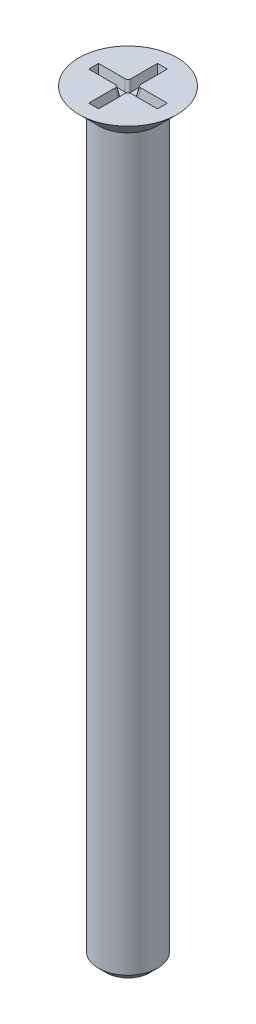
ISO-10303-21;
HEADER;
FILE_DESCRIPTION(('STEP AP214'),'2;1');
FILE_NAME('part.step','',(''),(''),'','','');
FILE_SCHEMA(('AUTOMOTIVE_DESIGN { 1 0 10303 214 1 1 1 1 }'));
ENDSEC;
DATA;
#1=APPLICATION_CONTEXT('core data for automotive mechanical design processes');
#2=APPLICATION_PROTOCOL_DEFINITION('international standard','automotive_design',2000,#1);
#3=PRODUCT_CONTEXT('',#1,'mechanical');
#4=PRODUCT('Part','Part','',(#3));
#5=PRODUCT_RELATED_PRODUCT_CATEGORY('part','',(#4));
#6=PRODUCT_DEFINITION_FORMATION('','',#4);
#7=PRODUCT_DEFINITION_CONTEXT('part definition',#1,'design');
#8=PRODUCT_DEFINITION('design','',#6,#7);
#9=PRODUCT_DEFINITION_SHAPE('','',#8);
#10=(LENGTH_UNIT() NAMED_UNIT(*) SI_UNIT(.MILLI.,.METRE.));
#11=(NAMED_UNIT(*) PLANE_ANGLE_UNIT() SI_UNIT($,.RADIAN.));
#12=(NAMED_UNIT(*) SI_UNIT($,.STERADIAN.) SOLID_ANGLE_UNIT());
#13=UNCERTAINTY_MEASURE_WITH_UNIT(LENGTH_MEASURE(1.E-05),#10,'distance_accuracy_value','');
#14=(GEOMETRIC_REPRESENTATION_CONTEXT(3) GLOBAL_UNCERTAINTY_ASSIGNED_CONTEXT((#13)) GLOBAL_UNIT_ASSIGNED_CONTEXT((#10,
#11,#12)) REPRESENTATION_CONTEXT('',''));
#15=CARTESIAN_POINT('',(0.,0.,0.));
#16=DIRECTION('',(0.,0.,1.));
#17=DIRECTION('',(1.,0.,0.));
#18=AXIS2_PLACEMENT_3D('',#15,#16,#17);
#19=CARTESIAN_POINT('',(0.,0.,0.));
#20=DIRECTION('',(0.,1.,0.));
#21=DIRECTION('',(0.,0.,1.));
#22=AXIS2_PLACEMENT_3D('',#19,#20,#21);
#23=PLANE('',#22);
#24=CARTESIAN_POINT('',(0.,0.,0.));
#25=DIRECTION('',(0.,-1.,0.));
#26=DIRECTION('',(0.,0.,-1.));
#27=AXIS2_PLACEMENT_3D('',#24,#25,#26);
#28=CIRCLE('',#27,5.);
#29=CARTESIAN_POINT('',(0.,0.,-5.));
#30=VERTEX_POINT('',#29);
#31=EDGE_CURVE('E258',#30,#30,#28,.T.);
#32=ORIENTED_EDGE('',*,*,#31,.F.);
#33=EDGE_LOOP('',(#32));
#34=FACE_BOUND('',#33,.T.);
#35=DIRECTION('',(1.,0.,0.));
#36=VECTOR('',#35,1.);
#37=CARTESIAN_POINT('',(0.,0.,-0.5));
#38=LINE('',#37,#36);
#39=CARTESIAN_POINT('',(-3.5,0.,-0.5));
#40=VERTEX_POINT('',#39);
#41=CARTESIAN_POINT('',(-0.795442325903664,0.,-0.5));
#42=VERTEX_POINT('',#41);
#43=EDGE_CURVE('E188',#40,#42,#38,.T.);
#44=ORIENTED_EDGE('',*,*,#43,.T.);
#45=CARTESIAN_POINT('',(-0.804627983565725,0.,-0.804627983565723));
#46=DIRECTION('',(0.,1.,0.));
#47=DIRECTION('',(-0.707106781186548,0.,-0.707106781186547));
#48=AXIS2_PLACEMENT_3D('',#45,#46,#47);
#49=ELLIPSE('',#48,0.309186702079241,0.3);
#50=CARTESIAN_POINT('',(-0.500000000000002,0.,-0.795442325903662));
#51=VERTEX_POINT('',#50);
#52=EDGE_CURVE('E276',#42,#51,#49,.T.);
#53=ORIENTED_EDGE('',*,*,#52,.T.);
#54=DIRECTION('',(0.,0.,1.));
#55=VECTOR('',#54,1.);
#56=CARTESIAN_POINT('',(-0.500000000000001,0.,0.));
#57=LINE('',#56,#55);
#58=CARTESIAN_POINT('',(-0.500000000000002,0.,-3.5));
#59=VERTEX_POINT('',#58);
#60=EDGE_CURVE('E186',#59,#51,#57,.T.);
#61=ORIENTED_EDGE('',*,*,#60,.F.);
#62=DIRECTION('',(1.,0.,0.));
#63=VECTOR('',#62,1.);
#64=CARTESIAN_POINT('',(0.,0.,-3.5));
#65=LINE('',#64,#63);
#66=CARTESIAN_POINT('',(0.499999999999998,0.,-3.5));
#67=VERTEX_POINT('',#66);
#68=EDGE_CURVE('E165',#59,#67,#65,.T.);
#69=ORIENTED_EDGE('',*,*,#68,.T.);
#70=DIRECTION('',(0.,0.,1.));
#71=VECTOR('',#70,1.);
#72=CARTESIAN_POINT('',(0.499999999999999,0.,0.));
#73=LINE('',#72,#71);
#74=CARTESIAN_POINT('',(0.499999999999999,0.,-0.795442325903662));
#75=VERTEX_POINT('',#74);
#76=EDGE_CURVE('E177',#67,#75,#73,.T.);
#77=ORIENTED_EDGE('',*,*,#76,.T.);
#78=CARTESIAN_POINT('',(0.804627983565722,0.,-0.804627983565723));
#79=DIRECTION('',(0.,1.,0.));
#80=DIRECTION('',(0.707106781186547,0.,-0.707106781186548));
#81=AXIS2_PLACEMENT_3D('',#78,#79,#80);
#82=ELLIPSE('',#81,0.309186702079241,0.3);
#83=CARTESIAN_POINT('',(0.795442325903661,0.,-0.5));
#84=VERTEX_POINT('',#83);
#85=EDGE_CURVE('E274',#75,#84,#82,.T.);
#86=ORIENTED_EDGE('',*,*,#85,.T.);
#87=DIRECTION('',(1.,0.,0.));
#88=VECTOR('',#87,1.);
#89=CARTESIAN_POINT('',(0.,0.,-0.5));
#90=LINE('',#89,#88);
#91=CARTESIAN_POINT('',(3.5,0.,-0.5));
#92=VERTEX_POINT('',#91);
#93=EDGE_CURVE('E182',#84,#92,#90,.T.);
#94=ORIENTED_EDGE('',*,*,#93,.T.);
#95=DIRECTION('',(0.,0.,-1.));
#96=VECTOR('',#95,1.);
#97=CARTESIAN_POINT('',(3.5,0.,0.));
#98=LINE('',#97,#96);
#99=CARTESIAN_POINT('',(3.5,0.,0.5));
#100=VERTEX_POINT('',#99);
#101=EDGE_CURVE('E208',#100,#92,#98,.T.);
#102=ORIENTED_EDGE('',*,*,#101,.F.);
#103=DIRECTION('',(1.,0.,0.));
#104=VECTOR('',#103,1.);
#105=CARTESIAN_POINT('',(0.,0.,0.5));
#106=LINE('',#105,#104);
#107=CARTESIAN_POINT('',(0.795442325903661,0.,0.5));
#108=VERTEX_POINT('',#107);
#109=EDGE_CURVE('E206',#108,#100,#106,.T.);
#110=ORIENTED_EDGE('',*,*,#109,.F.);
#111=CARTESIAN_POINT('',(0.804627983565722,0.,0.804627983565724));
#112=DIRECTION('',(0.,1.,0.));
#113=DIRECTION('',(0.707106781186548,0.,0.707106781186547));
#114=AXIS2_PLACEMENT_3D('',#111,#112,#113);
#115=ELLIPSE('',#114,0.309186702079241,0.3);
#116=CARTESIAN_POINT('',(0.499999999999999,0.,0.795442325903662));
#117=VERTEX_POINT('',#116);
#118=EDGE_CURVE('E270',#108,#117,#115,.T.);
#119=ORIENTED_EDGE('',*,*,#118,.T.);
#120=DIRECTION('',(0.,0.,1.));
#121=VECTOR('',#120,1.);
#122=CARTESIAN_POINT('',(0.499999999999999,0.,0.));
#123=LINE('',#122,#121);
#124=CARTESIAN_POINT('',(0.499999999999999,0.,3.5));
#125=VERTEX_POINT('',#124);
#126=EDGE_CURVE('E204',#117,#125,#123,.T.);
#127=ORIENTED_EDGE('',*,*,#126,.T.);
#128=DIRECTION('',(1.,0.,0.));
#129=VECTOR('',#128,1.);
#130=CARTESIAN_POINT('',(0.,0.,3.5));
#131=LINE('',#130,#129);
#132=CARTESIAN_POINT('',(-0.500000000000001,0.,3.5));
#133=VERTEX_POINT('',#132);
#134=EDGE_CURVE('E201',#133,#125,#131,.T.);
#135=ORIENTED_EDGE('',*,*,#134,.F.);
#136=DIRECTION('',(0.,0.,1.));
#137=VECTOR('',#136,1.);
#138=CARTESIAN_POINT('',(-0.500000000000001,0.,0.));
#139=LINE('',#138,#137);
#140=CARTESIAN_POINT('',(-0.500000000000001,0.,0.795442325903662));
#141=VERTEX_POINT('',#140);
#142=EDGE_CURVE('E199',#141,#133,#139,.T.);
#143=ORIENTED_EDGE('',*,*,#142,.F.);
#144=CARTESIAN_POINT('',(-0.804627983565725,0.,0.804627983565724));
#145=DIRECTION('',(0.,1.,0.));
#146=DIRECTION('',(-0.707106781186547,0.,0.707106781186548));
#147=AXIS2_PLACEMENT_3D('',#144,#145,#146);
#148=ELLIPSE('',#147,0.309186702079241,0.3);
#149=CARTESIAN_POINT('',(-0.795442325903664,0.,0.5));
#150=VERTEX_POINT('',#149);
#151=EDGE_CURVE('E272',#141,#150,#148,.T.);
#152=ORIENTED_EDGE('',*,*,#151,.T.);
#153=DIRECTION('',(1.,0.,0.));
#154=VECTOR('',#153,1.);
#155=CARTESIAN_POINT('',(0.,0.,0.5));
#156=LINE('',#155,#154);
#157=CARTESIAN_POINT('',(-3.5,0.,0.5));
#158=VERTEX_POINT('',#157);
#159=EDGE_CURVE('E196',#158,#150,#156,.T.);
#160=ORIENTED_EDGE('',*,*,#159,.F.);
#161=DIRECTION('',(0.,0.,-1.));
#162=VECTOR('',#161,1.);
#163=CARTESIAN_POINT('',(-3.5,0.,0.));
#164=LINE('',#163,#162);
#165=EDGE_CURVE('E193',#158,#40,#164,.T.);
#166=ORIENTED_EDGE('',*,*,#165,.T.);
#167=EDGE_LOOP('',(#44,#53,#61,#69,#77,#86,#94,#102,#110,#119,#127,#135,#143,#152,#160,#166));
#168=FACE_BOUND('',#167,.T.);
#169=ADVANCED_FACE('F49',(#34,#168),#23,.T.);
#170=CARTESIAN_POINT('',(0.,-2.,0.));
#171=DIRECTION('',(0.,1.,0.));
#172=DIRECTION('',(0.,0.,1.));
#173=AXIS2_PLACEMENT_3D('',#170,#171,#172);
#174=CONICAL_SURFACE('',#173,3.,0.785398163397448);
#175=ORIENTED_EDGE('',*,*,#31,.T.);
#176=EDGE_LOOP('',(#175));
#177=FACE_BOUND('',#176,.T.);
#178=CARTESIAN_POINT('',(0.,-2.,0.));
#179=DIRECTION('',(0.,-1.,0.));
#180=DIRECTION('',(0.,0.,-1.));
#181=AXIS2_PLACEMENT_3D('',#178,#179,#180);
#182=CIRCLE('',#181,3.);
#183=CARTESIAN_POINT('',(0.,-2.,-3.));
#184=VERTEX_POINT('',#183);
#185=EDGE_CURVE('E214',#184,#184,#182,.T.);
#186=ORIENTED_EDGE('',*,*,#185,.F.);
#187=EDGE_LOOP('',(#186));
#188=FACE_BOUND('',#187,.T.);
#189=ADVANCED_FACE('F353',(#177,#188),#174,.T.);
#190=CARTESIAN_POINT('',(0.,-77.,0.));
#191=DIRECTION('',(0.,1.,0.));
#192=DIRECTION('',(0.,0.,1.));
#193=AXIS2_PLACEMENT_3D('',#190,#191,#192);
#194=CYLINDRICAL_SURFACE('',#193,3.);
#195=CARTESIAN_POINT('',(0.,-76.2,0.));
#196=DIRECTION('',(0.,-1.,0.));
#197=DIRECTION('',(0.,0.,-1.));
#198=AXIS2_PLACEMENT_3D('',#195,#196,#197);
#199=CIRCLE('',#198,3.);
#200=CARTESIAN_POINT('',(0.,-76.2,-3.));
#201=VERTEX_POINT('',#200);
#202=EDGE_CURVE('E264',#201,#201,#199,.F.);
#203=ORIENTED_EDGE('',*,*,#202,.T.);
#204=EDGE_LOOP('',(#203));
#205=FACE_BOUND('',#204,.T.);
#206=ORIENTED_EDGE('',*,*,#185,.T.);
#207=EDGE_LOOP('',(#206));
#208=FACE_BOUND('',#207,.T.);
#209=ADVANCED_FACE('F361',(#205,#208),#194,.T.);
#210=CARTESIAN_POINT('',(0.,-77.,0.));
#211=DIRECTION('',(0.,-1.,0.));
#212=DIRECTION('',(0.,0.,-1.));
#213=AXIS2_PLACEMENT_3D('',#210,#211,#212);
#214=PLANE('',#213);
#215=CARTESIAN_POINT('',(0.,-77.,0.));
#216=DIRECTION('',(0.,-1.,0.));
#217=DIRECTION('',(0.,0.,-1.));
#218=AXIS2_PLACEMENT_3D('',#215,#216,#217);
#219=CIRCLE('',#218,2.20000000000001);
#220=CARTESIAN_POINT('',(0.,-77.,-2.20000000000001));
#221=VERTEX_POINT('',#220);
#222=EDGE_CURVE('E261',#221,#221,#219,.T.);
#223=ORIENTED_EDGE('',*,*,#222,.T.);
#224=EDGE_LOOP('',(#223));
#225=FACE_BOUND('',#224,.T.);
#226=ADVANCED_FACE('F373',(#225),#214,.T.);
#227=CARTESIAN_POINT('',(0.,-77.,0.));
#228=DIRECTION('',(0.,1.,0.));
#229=DIRECTION('',(0.,0.,1.));
#230=AXIS2_PLACEMENT_3D('',#227,#228,#229);
#231=CONICAL_SURFACE('',#230,2.20000000000001,0.785398163397443);
#232=ORIENTED_EDGE('',*,*,#202,.F.);
#233=EDGE_LOOP('',(#232));
#234=FACE_BOUND('',#233,.T.);
#235=ORIENTED_EDGE('',*,*,#222,.F.);
#236=EDGE_LOOP('',(#235));
#237=FACE_BOUND('',#236,.T.);
#238=ADVANCED_FACE('F368',(#234,#237),#231,.T.);
#239=CARTESIAN_POINT('',(0.,0.,-0.5));
#240=DIRECTION('',(0.,-0.17364817766693,-0.984807753012208));
#241=DIRECTION('',(0.,0.984807753012208,-0.17364817766693));
#242=AXIS2_PLACEMENT_3D('',#239,#240,#241);
#243=PLANE('',#242);
#244=ORIENTED_EDGE('',*,*,#93,.F.);
#245=DIRECTION('',(-0.171087869746036,-0.970287525247814,0.171087869746036));
#246=VECTOR('',#245,1.);
#247=CARTESIAN_POINT('',(0.772158886512443,-0.132046946517587,-0.476716560608782));
#248=LINE('',#247,#246);
#249=CARTESIAN_POINT('',(0.619115345195196,-1.,-0.323673019291535));
#250=VERTEX_POINT('',#249);
#251=EDGE_CURVE('E281',#84,#250,#248,.T.);
#252=ORIENTED_EDGE('',*,*,#251,.T.);
#253=DIRECTION('',(-1.,0.,0.));
#254=VECTOR('',#253,1.);
#255=CARTESIAN_POINT('',(0.,-1.,-0.323673019291535));
#256=LINE('',#255,#254);
#257=CARTESIAN_POINT('',(3.32367301929154,-1.,-0.323673019291535));
#258=VERTEX_POINT('',#257);
#259=EDGE_CURVE('E211',#250,#258,#256,.F.);
#260=ORIENTED_EDGE('',*,*,#259,.T.);
#261=DIRECTION('',(-0.171087869746036,-0.970287525247814,0.171087869746036));
#262=VECTOR('',#261,1.);
#263=CARTESIAN_POINT('',(3.39755129289017,-0.581015490075304,-0.397551292890172));
#264=LINE('',#263,#262);
#265=EDGE_CURVE('E212',#258,#92,#264,.F.);
#266=ORIENTED_EDGE('',*,*,#265,.T.);
#267=EDGE_LOOP('',(#244,#252,#260,#266));
#268=FACE_BOUND('',#267,.T.);
#269=ADVANCED_FACE('F337',(#268),#243,.F.);
#270=CARTESIAN_POINT('',(3.5,0.,0.));
#271=DIRECTION('',(0.984807753012208,-0.17364817766693,0.));
#272=DIRECTION('',(0.17364817766693,0.984807753012208,0.));
#273=AXIS2_PLACEMENT_3D('',#270,#271,#272);
#274=PLANE('',#273);
#275=ORIENTED_EDGE('',*,*,#101,.T.);
#276=ORIENTED_EDGE('',*,*,#265,.F.);
#277=DIRECTION('',(0.,0.,-1.));
#278=VECTOR('',#277,1.);
#279=CARTESIAN_POINT('',(3.32367301929154,-1.,0.));
#280=LINE('',#279,#278);
#281=CARTESIAN_POINT('',(3.32367301929154,-1.,0.323673019291535));
#282=VERTEX_POINT('',#281);
#283=EDGE_CURVE('E173',#282,#258,#280,.T.);
#284=ORIENTED_EDGE('',*,*,#283,.F.);
#285=DIRECTION('',(0.171087869746036,0.970287525247814,0.171087869746036));
#286=VECTOR('',#285,1.);
#287=CARTESIAN_POINT('',(3.39755129289017,-0.581015490075304,0.397551292890173));
#288=LINE('',#287,#286);
#289=EDGE_CURVE('E215',#282,#100,#288,.T.);
#290=ORIENTED_EDGE('',*,*,#289,.T.);
#291=EDGE_LOOP('',(#275,#276,#284,#290));
#292=FACE_BOUND('',#291,.T.);
#293=ADVANCED_FACE('F341',(#292),#274,.F.);
#294=CARTESIAN_POINT('',(0.,0.,0.5));
#295=DIRECTION('',(0.,-0.17364817766693,0.984807753012208));
#296=DIRECTION('',(0.,-0.984807753012208,-0.17364817766693));
#297=AXIS2_PLACEMENT_3D('',#294,#295,#296);
#298=PLANE('',#297);
#299=DIRECTION('',(1.,0.,0.));
#300=VECTOR('',#299,1.);
#301=CARTESIAN_POINT('',(0.,-1.,0.323673019291535));
#302=LINE('',#301,#300);
#303=CARTESIAN_POINT('',(0.619115345195196,-1.,0.323673019291535));
#304=VERTEX_POINT('',#303);
#305=EDGE_CURVE('E234',#304,#282,#302,.T.);
#306=ORIENTED_EDGE('',*,*,#305,.F.);
#307=DIRECTION('',(-0.171087869746036,-0.970287525247814,-0.171087869746036));
#308=VECTOR('',#307,1.);
#309=CARTESIAN_POINT('',(0.786794416099561,-0.0490447336496869,0.4913520901959));
#310=LINE('',#309,#308);
#311=EDGE_CURVE('E288',#304,#108,#310,.F.);
#312=ORIENTED_EDGE('',*,*,#311,.T.);
#313=ORIENTED_EDGE('',*,*,#109,.T.);
#314=ORIENTED_EDGE('',*,*,#289,.F.);
#315=EDGE_LOOP('',(#306,#312,#313,#314));
#316=FACE_BOUND('',#315,.T.);
#317=ADVANCED_FACE('F345',(#316),#298,.F.);
#318=CARTESIAN_POINT('',(0.499999999999999,0.,0.));
#319=DIRECTION('',(0.984807753012208,-0.17364817766693,0.));
#320=DIRECTION('',(0.17364817766693,0.984807753012208,0.));
#321=AXIS2_PLACEMENT_3D('',#318,#319,#320);
#322=PLANE('',#321);
#323=ORIENTED_EDGE('',*,*,#126,.F.);
#324=DIRECTION('',(0.171087869746036,0.970287525247814,0.171087869746036));
#325=VECTOR('',#324,1.);
#326=CARTESIAN_POINT('',(0.315025109487434,-1.04904473364969,0.610467435391097));
#327=LINE('',#326,#325);
#328=CARTESIAN_POINT('',(0.323673019291534,-1.,0.619115345195198));
#329=VERTEX_POINT('',#328);
#330=EDGE_CURVE('E64',#117,#329,#327,.F.);
#331=ORIENTED_EDGE('',*,*,#330,.T.);
#332=DIRECTION('',(0.,0.,-1.));
#333=VECTOR('',#332,1.);
#334=CARTESIAN_POINT('',(0.323673019291534,-1.,0.));
#335=LINE('',#334,#333);
#336=CARTESIAN_POINT('',(0.323673019291534,-1.,3.32367301929153));
#337=VERTEX_POINT('',#336);
#338=EDGE_CURVE('E236',#329,#337,#335,.F.);
#339=ORIENTED_EDGE('',*,*,#338,.T.);
#340=DIRECTION('',(-0.171087869746036,-0.970287525247814,-0.171087869746036));
#341=VECTOR('',#340,1.);
#342=CARTESIAN_POINT('',(0.397551292890172,-0.581015490075304,3.39755129289017));
#343=LINE('',#342,#341);
#344=EDGE_CURVE('E225',#337,#125,#343,.F.);
#345=ORIENTED_EDGE('',*,*,#344,.T.);
#346=EDGE_LOOP('',(#323,#331,#339,#345));
#347=FACE_BOUND('',#346,.T.);
#348=ADVANCED_FACE('F463',(#347),#322,.F.);
#349=CARTESIAN_POINT('',(0.,0.,3.5));
#350=DIRECTION('',(0.,-0.17364817766693,0.984807753012208));
#351=DIRECTION('',(0.,-0.984807753012208,-0.17364817766693));
#352=AXIS2_PLACEMENT_3D('',#349,#350,#351);
#353=PLANE('',#352);
#354=ORIENTED_EDGE('',*,*,#134,.T.);
#355=ORIENTED_EDGE('',*,*,#344,.F.);
#356=DIRECTION('',(1.,0.,0.));
#357=VECTOR('',#356,1.);
#358=CARTESIAN_POINT('',(0.,-1.,3.32367301929153));
#359=LINE('',#358,#357);
#360=CARTESIAN_POINT('',(-0.323673019291536,-1.,3.32367301929153));
#361=VERTEX_POINT('',#360);
#362=EDGE_CURVE('E238',#361,#337,#359,.T.);
#363=ORIENTED_EDGE('',*,*,#362,.F.);
#364=DIRECTION('',(-0.171087869746036,0.970287525247814,0.171087869746036));
#365=VECTOR('',#364,1.);
#366=CARTESIAN_POINT('',(-0.397551292890174,-0.581015490075304,3.39755129289017));
#367=LINE('',#366,#365);
#368=EDGE_CURVE('E222',#361,#133,#367,.T.);
#369=ORIENTED_EDGE('',*,*,#368,.T.);
#370=EDGE_LOOP('',(#354,#355,#363,#369));
#371=FACE_BOUND('',#370,.T.);
#372=ADVANCED_FACE('F455',(#371),#353,.F.);
#373=CARTESIAN_POINT('',(-0.500000000000001,0.,0.));
#374=DIRECTION('',(-0.984807753012208,-0.17364817766693,0.));
#375=DIRECTION('',(0.17364817766693,-0.984807753012208,0.));
#376=AXIS2_PLACEMENT_3D('',#373,#374,#375);
#377=PLANE('',#376);
#378=DIRECTION('',(0.,0.,1.));
#379=VECTOR('',#378,1.);
#380=CARTESIAN_POINT('',(-0.323673019291536,-1.,0.));
#381=LINE('',#380,#379);
#382=CARTESIAN_POINT('',(-0.323673019291536,-1.,0.619115345195198));
#383=VERTEX_POINT('',#382);
#384=EDGE_CURVE('E241',#383,#361,#381,.T.);
#385=ORIENTED_EDGE('',*,*,#384,.F.);
#386=DIRECTION('',(-0.171087869746036,0.970287525247814,0.171087869746036));
#387=VECTOR('',#386,1.);
#388=CARTESIAN_POINT('',(-0.476716560608783,-0.132046946517587,0.772158886512444));
#389=LINE('',#388,#387);
#390=EDGE_CURVE('E283',#383,#141,#389,.T.);
#391=ORIENTED_EDGE('',*,*,#390,.T.);
#392=ORIENTED_EDGE('',*,*,#142,.T.);
#393=ORIENTED_EDGE('',*,*,#368,.F.);
#394=EDGE_LOOP('',(#385,#391,#392,#393));
#395=FACE_BOUND('',#394,.T.);
#396=ADVANCED_FACE('F306',(#395),#377,.F.);
#397=CARTESIAN_POINT('',(0.,0.,0.5));
#398=DIRECTION('',(0.,-0.17364817766693,0.984807753012208));
#399=DIRECTION('',(0.,-0.984807753012208,-0.17364817766693));
#400=AXIS2_PLACEMENT_3D('',#397,#398,#399);
#401=PLANE('',#400);
#402=ORIENTED_EDGE('',*,*,#159,.T.);
#403=DIRECTION('',(-0.171087869746036,0.970287525247814,0.171087869746036));
#404=VECTOR('',#403,1.);
#405=CARTESIAN_POINT('',(-0.772158886512445,-0.132046946517588,0.476716560608782));
#406=LINE('',#405,#404);
#407=CARTESIAN_POINT('',(-0.619115345195199,-1.,0.323673019291535));
#408=VERTEX_POINT('',#407);
#409=EDGE_CURVE('E286',#150,#408,#406,.F.);
#410=ORIENTED_EDGE('',*,*,#409,.T.);
#411=DIRECTION('',(1.,0.,0.));
#412=VECTOR('',#411,1.);
#413=CARTESIAN_POINT('',(0.,-1.,0.323673019291535));
#414=LINE('',#413,#412);
#415=CARTESIAN_POINT('',(-3.32367301929153,-1.,0.323673019291535));
#416=VERTEX_POINT('',#415);
#417=EDGE_CURVE('E243',#416,#408,#414,.T.);
#418=ORIENTED_EDGE('',*,*,#417,.F.);
#419=DIRECTION('',(0.171087869746036,-0.970287525247814,-0.171087869746036));
#420=VECTOR('',#419,1.);
#421=CARTESIAN_POINT('',(-3.39755129289017,-0.581015490075304,0.397551292890173));
#422=LINE('',#421,#420);
#423=EDGE_CURVE('E220',#416,#158,#422,.F.);
#424=ORIENTED_EDGE('',*,*,#423,.T.);
#425=EDGE_LOOP('',(#402,#410,#418,#424));
#426=FACE_BOUND('',#425,.T.);
#427=ADVANCED_FACE('F313',(#426),#401,.F.);
#428=CARTESIAN_POINT('',(-3.5,0.,0.));
#429=DIRECTION('',(-0.984807753012208,-0.17364817766693,0.));
#430=DIRECTION('',(0.17364817766693,-0.984807753012208,0.));
#431=AXIS2_PLACEMENT_3D('',#428,#429,#430);
#432=PLANE('',#431);
#433=ORIENTED_EDGE('',*,*,#165,.F.);
#434=ORIENTED_EDGE('',*,*,#423,.F.);
#435=DIRECTION('',(0.,0.,1.));
#436=VECTOR('',#435,1.);
#437=CARTESIAN_POINT('',(-3.32367301929153,-1.,0.));
#438=LINE('',#437,#436);
#439=CARTESIAN_POINT('',(-3.32367301929153,-1.,-0.323673019291535));
#440=VERTEX_POINT('',#439);
#441=EDGE_CURVE('E246',#416,#440,#438,.F.);
#442=ORIENTED_EDGE('',*,*,#441,.T.);
#443=DIRECTION('',(-0.171087869746036,0.970287525247814,-0.171087869746036));
#444=VECTOR('',#443,1.);
#445=CARTESIAN_POINT('',(-3.39755129289017,-0.581015490075304,-0.397551292890172));
#446=LINE('',#445,#444);
#447=EDGE_CURVE('E218',#440,#40,#446,.T.);
#448=ORIENTED_EDGE('',*,*,#447,.T.);
#449=EDGE_LOOP('',(#433,#434,#442,#448));
#450=FACE_BOUND('',#449,.T.);
#451=ADVANCED_FACE('F316',(#450),#432,.F.);
#452=CARTESIAN_POINT('',(0.,0.,-0.5));
#453=DIRECTION('',(0.,-0.17364817766693,-0.984807753012208));
#454=DIRECTION('',(0.,0.984807753012208,-0.17364817766693));
#455=AXIS2_PLACEMENT_3D('',#452,#453,#454);
#456=PLANE('',#455);
#457=DIRECTION('',(-1.,0.,0.));
#458=VECTOR('',#457,1.);
#459=CARTESIAN_POINT('',(0.,-1.,-0.323673019291535));
#460=LINE('',#459,#458);
#461=CARTESIAN_POINT('',(-0.619115345195199,-1.,-0.323673019291535));
#462=VERTEX_POINT('',#461);
#463=EDGE_CURVE('E248',#440,#462,#460,.F.);
#464=ORIENTED_EDGE('',*,*,#463,.T.);
#465=DIRECTION('',(-0.171087869746036,0.970287525247814,-0.171087869746036));
#466=VECTOR('',#465,1.);
#467=CARTESIAN_POINT('',(-0.786794416099564,-0.049044733649687,-0.4913520901959));
#468=LINE('',#467,#466);
#469=EDGE_CURVE('E267',#462,#42,#468,.T.);
#470=ORIENTED_EDGE('',*,*,#469,.T.);
#471=ORIENTED_EDGE('',*,*,#43,.F.);
#472=ORIENTED_EDGE('',*,*,#447,.F.);
#473=EDGE_LOOP('',(#464,#470,#471,#472));
#474=FACE_BOUND('',#473,.T.);
#475=ADVANCED_FACE('F320',(#474),#456,.F.);
#476=CARTESIAN_POINT('',(-0.500000000000001,0.,0.));
#477=DIRECTION('',(-0.984807753012208,-0.17364817766693,0.));
#478=DIRECTION('',(0.17364817766693,-0.984807753012208,0.));
#479=AXIS2_PLACEMENT_3D('',#476,#477,#478);
#480=PLANE('',#479);
#481=ORIENTED_EDGE('',*,*,#60,.T.);
#482=DIRECTION('',(0.171087869746036,-0.970287525247814,0.171087869746036));
#483=VECTOR('',#482,1.);
#484=CARTESIAN_POINT('',(-0.315025109487436,-1.04904473364969,-0.610467435391097));
#485=LINE('',#484,#483);
#486=CARTESIAN_POINT('',(-0.323673019291536,-1.,-0.619115345195197));
#487=VERTEX_POINT('',#486);
#488=EDGE_CURVE('E278',#51,#487,#485,.T.);
#489=ORIENTED_EDGE('',*,*,#488,.T.);
#490=DIRECTION('',(0.,0.,1.));
#491=VECTOR('',#490,1.);
#492=CARTESIAN_POINT('',(-0.323673019291536,-1.,0.));
#493=LINE('',#492,#491);
#494=CARTESIAN_POINT('',(-0.323673019291537,-1.,-3.32367301929154));
#495=VERTEX_POINT('',#494);
#496=EDGE_CURVE('E251',#495,#487,#493,.T.);
#497=ORIENTED_EDGE('',*,*,#496,.F.);
#498=DIRECTION('',(0.171087869746036,-0.970287525247814,0.171087869746036));
#499=VECTOR('',#498,1.);
#500=CARTESIAN_POINT('',(-0.397551292890174,-0.581015490075304,-3.39755129289017));
#501=LINE('',#500,#499);
#502=EDGE_CURVE('E172',#495,#59,#501,.F.);
#503=ORIENTED_EDGE('',*,*,#502,.T.);
#504=EDGE_LOOP('',(#481,#489,#497,#503));
#505=FACE_BOUND('',#504,.T.);
#506=ADVANCED_FACE('F329',(#505),#480,.F.);
#507=CARTESIAN_POINT('',(0.,0.,-3.5));
#508=DIRECTION('',(0.,-0.17364817766693,-0.984807753012208));
#509=DIRECTION('',(0.,0.984807753012208,-0.17364817766693));
#510=AXIS2_PLACEMENT_3D('',#507,#508,#509);
#511=PLANE('',#510);
#512=ORIENTED_EDGE('',*,*,#68,.F.);
#513=ORIENTED_EDGE('',*,*,#502,.F.);
#514=DIRECTION('',(-1.,0.,0.));
#515=VECTOR('',#514,1.);
#516=CARTESIAN_POINT('',(0.,-1.,-3.32367301929154));
#517=LINE('',#516,#515);
#518=CARTESIAN_POINT('',(0.323673019291533,-1.,-3.32367301929154));
#519=VERTEX_POINT('',#518);
#520=EDGE_CURVE('E168',#495,#519,#517,.F.);
#521=ORIENTED_EDGE('',*,*,#520,.T.);
#522=DIRECTION('',(0.171087869746036,0.970287525247814,-0.171087869746036));
#523=VECTOR('',#522,1.);
#524=CARTESIAN_POINT('',(0.397551292890171,-0.581015490075304,-3.39755129289017));
#525=LINE('',#524,#523);
#526=EDGE_CURVE('E161',#519,#67,#525,.T.);
#527=ORIENTED_EDGE('',*,*,#526,.T.);
#528=EDGE_LOOP('',(#512,#513,#521,#527));
#529=FACE_BOUND('',#528,.T.);
#530=ADVANCED_FACE('F163',(#529),#511,.F.);
#531=CARTESIAN_POINT('',(0.499999999999999,0.,0.));
#532=DIRECTION('',(0.984807753012208,-0.17364817766693,0.));
#533=DIRECTION('',(0.17364817766693,0.984807753012208,0.));
#534=AXIS2_PLACEMENT_3D('',#531,#532,#533);
#535=PLANE('',#534);
#536=DIRECTION('',(0.,0.,-1.));
#537=VECTOR('',#536,1.);
#538=CARTESIAN_POINT('',(0.323673019291534,-1.,0.));
#539=LINE('',#538,#537);
#540=CARTESIAN_POINT('',(0.323673019291533,-1.,-0.619115345195197));
#541=VERTEX_POINT('',#540);
#542=EDGE_CURVE('E231',#519,#541,#539,.F.);
#543=ORIENTED_EDGE('',*,*,#542,.T.);
#544=DIRECTION('',(-0.171087869746036,-0.970287525247814,0.171087869746036));
#545=VECTOR('',#544,1.);
#546=CARTESIAN_POINT('',(0.47671656060878,-0.132046946517587,-0.772158886512444));
#547=LINE('',#546,#545);
#548=EDGE_CURVE('E180',#541,#75,#547,.F.);
#549=ORIENTED_EDGE('',*,*,#548,.T.);
#550=ORIENTED_EDGE('',*,*,#76,.F.);
#551=ORIENTED_EDGE('',*,*,#526,.F.);
#552=EDGE_LOOP('',(#543,#549,#550,#551));
#553=FACE_BOUND('',#552,.T.);
#554=ADVANCED_FACE('F178',(#553),#535,.F.);
#555=CARTESIAN_POINT('',(0.,-1.,0.));
#556=DIRECTION('',(0.,1.,0.));
#557=DIRECTION('',(0.,0.,1.));
#558=AXIS2_PLACEMENT_3D('',#555,#556,#557);
#559=PLANE('',#558);
#560=ORIENTED_EDGE('',*,*,#259,.F.);
#561=CARTESIAN_POINT('',(0.628301002857257,-1.,-0.628301002857258));
#562=DIRECTION('',(0.,1.,0.));
#563=DIRECTION('',(0.707106781186547,0.,-0.707106781186548));
#564=AXIS2_PLACEMENT_3D('',#561,#562,#563);
#565=ELLIPSE('',#564,0.309186702079241,0.3);
#566=EDGE_CURVE('E294',#250,#541,#565,.F.);
#567=ORIENTED_EDGE('',*,*,#566,.T.);
#568=ORIENTED_EDGE('',*,*,#542,.F.);
#569=ORIENTED_EDGE('',*,*,#520,.F.);
#570=ORIENTED_EDGE('',*,*,#496,.T.);
#571=CARTESIAN_POINT('',(-0.62830100285726,-1.,-0.628301002857258));
#572=DIRECTION('',(0.,1.,0.));
#573=DIRECTION('',(-0.707106781186548,0.,-0.707106781186547));
#574=AXIS2_PLACEMENT_3D('',#571,#572,#573);
#575=ELLIPSE('',#574,0.309186702079241,0.3);
#576=EDGE_CURVE('E292',#487,#462,#575,.F.);
#577=ORIENTED_EDGE('',*,*,#576,.T.);
#578=ORIENTED_EDGE('',*,*,#463,.F.);
#579=ORIENTED_EDGE('',*,*,#441,.F.);
#580=ORIENTED_EDGE('',*,*,#417,.T.);
#581=CARTESIAN_POINT('',(-0.62830100285726,-1.,0.628301002857258));
#582=DIRECTION('',(0.,1.,0.));
#583=DIRECTION('',(-0.707106781186547,0.,0.707106781186548));
#584=AXIS2_PLACEMENT_3D('',#581,#582,#583);
#585=ELLIPSE('',#584,0.309186702079241,0.3);
#586=EDGE_CURVE('E57',#408,#383,#585,.F.);
#587=ORIENTED_EDGE('',*,*,#586,.T.);
#588=ORIENTED_EDGE('',*,*,#384,.T.);
#589=ORIENTED_EDGE('',*,*,#362,.T.);
#590=ORIENTED_EDGE('',*,*,#338,.F.);
#591=CARTESIAN_POINT('',(0.628301002857257,-1.,0.628301002857259));
#592=DIRECTION('',(0.,1.,0.));
#593=DIRECTION('',(0.707106781186548,0.,0.707106781186547));
#594=AXIS2_PLACEMENT_3D('',#591,#592,#593);
#595=ELLIPSE('',#594,0.309186702079241,0.3);
#596=EDGE_CURVE('E11',#329,#304,#595,.F.);
#597=ORIENTED_EDGE('',*,*,#596,.T.);
#598=ORIENTED_EDGE('',*,*,#305,.T.);
#599=ORIENTED_EDGE('',*,*,#283,.T.);
#600=EDGE_LOOP('',(#560,#567,#568,#569,#570,#577,#578,#579,#580,#587,#588,#589,#590,#597,#598,#599));
#601=FACE_BOUND('',#600,.T.);
#602=ADVANCED_FACE('F298',(#601),#559,.T.);
#603=CARTESIAN_POINT('',(-0.772158886512445,-0.184141399817667,-0.772158886512444));
#604=DIRECTION('',(-0.171087869746036,0.970287525247814,-0.171087869746036));
#605=DIRECTION('',(-0.984807753012208,-0.17364817766693,0.));
#606=AXIS2_PLACEMENT_3D('',#603,#604,#605);
#607=CYLINDRICAL_SURFACE('',#606,0.3);
#608=ORIENTED_EDGE('',*,*,#576,.F.);
#609=ORIENTED_EDGE('',*,*,#488,.F.);
#610=ORIENTED_EDGE('',*,*,#52,.F.);
#611=ORIENTED_EDGE('',*,*,#469,.F.);
#612=EDGE_LOOP('',(#608,#609,#610,#611));
#613=FACE_BOUND('',#612,.T.);
#614=ADVANCED_FACE('F325',(#613),#607,.T.);
#615=CARTESIAN_POINT('',(0.772158886512443,-0.184141399817667,-0.772158886512444));
#616=DIRECTION('',(0.171087869746036,0.970287525247814,-0.171087869746036));
#617=DIRECTION('',(0.,0.17364817766693,0.984807753012208));
#618=AXIS2_PLACEMENT_3D('',#615,#616,#617);
#619=CYLINDRICAL_SURFACE('',#618,0.3);
#620=ORIENTED_EDGE('',*,*,#566,.F.);
#621=ORIENTED_EDGE('',*,*,#251,.F.);
#622=ORIENTED_EDGE('',*,*,#85,.F.);
#623=ORIENTED_EDGE('',*,*,#548,.F.);
#624=EDGE_LOOP('',(#620,#621,#622,#623));
#625=FACE_BOUND('',#624,.T.);
#626=ADVANCED_FACE('F332',(#625),#619,.T.);
#627=CARTESIAN_POINT('',(-0.772158886512445,-0.184141399817667,0.772158886512444));
#628=DIRECTION('',(-0.171087869746036,0.970287525247814,0.171087869746036));
#629=DIRECTION('',(0.,-0.17364817766693,0.984807753012208));
#630=AXIS2_PLACEMENT_3D('',#627,#628,#629);
#631=CYLINDRICAL_SURFACE('',#630,0.3);
#632=ORIENTED_EDGE('',*,*,#586,.F.);
#633=ORIENTED_EDGE('',*,*,#409,.F.);
#634=ORIENTED_EDGE('',*,*,#151,.F.);
#635=ORIENTED_EDGE('',*,*,#390,.F.);
#636=EDGE_LOOP('',(#632,#633,#634,#635));
#637=FACE_BOUND('',#636,.T.);
#638=ADVANCED_FACE('F309',(#637),#631,.T.);
#639=CARTESIAN_POINT('',(0.772158886512443,-0.184141399817666,0.772158886512444));
#640=DIRECTION('',(0.171087869746036,0.970287525247814,0.171087869746036));
#641=DIRECTION('',(-0.984807753012208,0.17364817766693,0.));
#642=AXIS2_PLACEMENT_3D('',#639,#640,#641);
#643=CYLINDRICAL_SURFACE('',#642,0.3);
#644=ORIENTED_EDGE('',*,*,#596,.F.);
#645=ORIENTED_EDGE('',*,*,#330,.F.);
#646=ORIENTED_EDGE('',*,*,#118,.F.);
#647=ORIENTED_EDGE('',*,*,#311,.F.);
#648=EDGE_LOOP('',(#644,#645,#646,#647));
#649=FACE_BOUND('',#648,.T.);
#650=ADVANCED_FACE('F51',(#649),#643,.T.);
#651=CLOSED_SHELL('',(#169,#189,#209,#226,#238,#269,#293,#317,#348,#372,#396,#427,#451,#475,
#506,#530,#554,#602,#614,#626,#638,#650));
#652=MANIFOLD_SOLID_BREP('B2',#651);
#653=ADVANCED_BREP_SHAPE_REPRESENTATION('',(#18,#652),#14);
#654=SHAPE_DEFINITION_REPRESENTATION(#9,#653);
ENDSEC;
END-ISO-10303-21;
